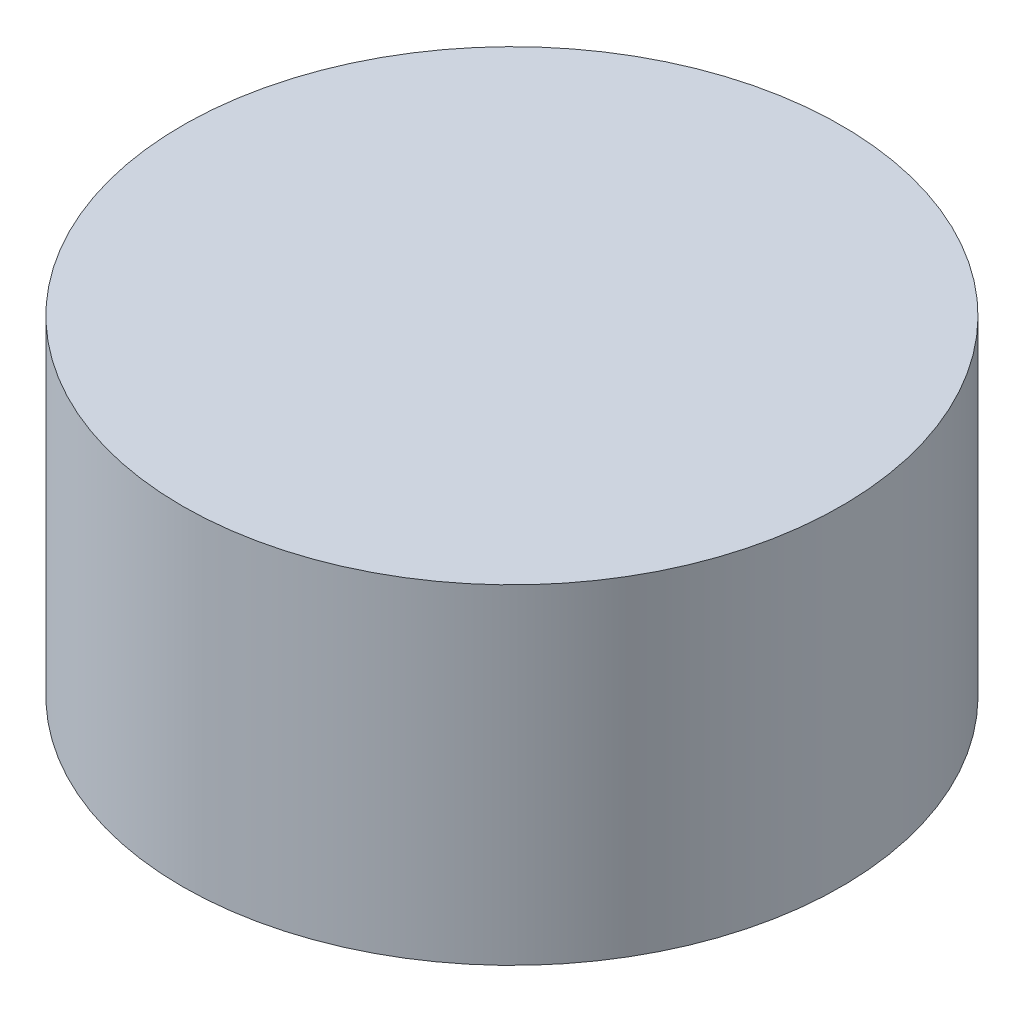
ISO-10303-21;
HEADER;
FILE_DESCRIPTION(('STEP AP214'),'2;1');
FILE_NAME('part.step','',(''),(''),'','','');
FILE_SCHEMA(('AUTOMOTIVE_DESIGN { 1 0 10303 214 1 1 1 1 }'));
ENDSEC;
DATA;
#1=APPLICATION_CONTEXT('core data for automotive mechanical design processes');
#2=APPLICATION_PROTOCOL_DEFINITION('international standard','automotive_design',2000,#1);
#3=PRODUCT_CONTEXT('',#1,'mechanical');
#4=PRODUCT('Part','Part','',(#3));
#5=PRODUCT_RELATED_PRODUCT_CATEGORY('part','',(#4));
#6=PRODUCT_DEFINITION_FORMATION('','',#4);
#7=PRODUCT_DEFINITION_CONTEXT('part definition',#1,'design');
#8=PRODUCT_DEFINITION('design','',#6,#7);
#9=PRODUCT_DEFINITION_SHAPE('','',#8);
#10=(LENGTH_UNIT() NAMED_UNIT(*) SI_UNIT(.MILLI.,.METRE.));
#11=(NAMED_UNIT(*) PLANE_ANGLE_UNIT() SI_UNIT($,.RADIAN.));
#12=(NAMED_UNIT(*) SI_UNIT($,.STERADIAN.) SOLID_ANGLE_UNIT());
#13=UNCERTAINTY_MEASURE_WITH_UNIT(LENGTH_MEASURE(1.E-05),#10,'distance_accuracy_value','');
#14=(GEOMETRIC_REPRESENTATION_CONTEXT(3) GLOBAL_UNCERTAINTY_ASSIGNED_CONTEXT((#13)) GLOBAL_UNIT_ASSIGNED_CONTEXT((#10,
#11,#12)) REPRESENTATION_CONTEXT('',''));
#15=CARTESIAN_POINT('',(0.,0.,0.));
#16=DIRECTION('',(0.,0.,1.));
#17=DIRECTION('',(1.,0.,0.));
#18=AXIS2_PLACEMENT_3D('',#15,#16,#17);
#19=CARTESIAN_POINT('',(0.,63.5,0.));
#20=DIRECTION('',(0.,-1.,0.));
#21=DIRECTION('',(0.,0.,-1.));
#22=AXIS2_PLACEMENT_3D('',#19,#20,#21);
#23=CYLINDRICAL_SURFACE('',#22,63.5);
#24=CARTESIAN_POINT('',(0.,63.5,0.));
#25=DIRECTION('',(0.,1.,0.));
#26=DIRECTION('',(0.,0.,1.));
#27=AXIS2_PLACEMENT_3D('',#24,#25,#26);
#28=CIRCLE('',#27,63.5);
#29=CARTESIAN_POINT('',(0.,63.5,63.5));
#30=VERTEX_POINT('',#29);
#31=EDGE_CURVE('E10',#30,#30,#28,.T.);
#32=ORIENTED_EDGE('',*,*,#31,.F.);
#33=EDGE_LOOP('',(#32));
#34=FACE_BOUND('',#33,.T.);
#35=CARTESIAN_POINT('',(0.,0.,0.));
#36=DIRECTION('',(0.,1.,0.));
#37=DIRECTION('',(0.,0.,1.));
#38=AXIS2_PLACEMENT_3D('',#35,#36,#37);
#39=CIRCLE('',#38,63.5);
#40=CARTESIAN_POINT('',(0.,0.,63.5));
#41=VERTEX_POINT('',#40);
#42=EDGE_CURVE('E34',#41,#41,#39,.T.);
#43=ORIENTED_EDGE('',*,*,#42,.T.);
#44=EDGE_LOOP('',(#43));
#45=FACE_BOUND('',#44,.T.);
#46=ADVANCED_FACE('F31',(#34,#45),#23,.T.);
#47=CARTESIAN_POINT('',(0.,63.5,0.));
#48=DIRECTION('',(0.,1.,0.));
#49=DIRECTION('',(0.,0.,1.));
#50=AXIS2_PLACEMENT_3D('',#47,#48,#49);
#51=PLANE('',#50);
#52=ORIENTED_EDGE('',*,*,#31,.T.);
#53=EDGE_LOOP('',(#52));
#54=FACE_BOUND('',#53,.T.);
#55=ADVANCED_FACE('F46',(#54),#51,.T.);
#56=CARTESIAN_POINT('',(0.,0.,0.));
#57=DIRECTION('',(0.,1.,0.));
#58=DIRECTION('',(0.,0.,1.));
#59=AXIS2_PLACEMENT_3D('',#56,#57,#58);
#60=PLANE('',#59);
#61=ORIENTED_EDGE('',*,*,#42,.F.);
#62=EDGE_LOOP('',(#61));
#63=FACE_BOUND('',#62,.T.);
#64=ADVANCED_FACE('F44',(#63),#60,.F.);
#65=CLOSED_SHELL('',(#46,#55,#64));
#66=MANIFOLD_SOLID_BREP('B2',#65);
#67=ADVANCED_BREP_SHAPE_REPRESENTATION('',(#18,#66),#14);
#68=SHAPE_DEFINITION_REPRESENTATION(#9,#67);
ENDSEC;
END-ISO-10303-21;
